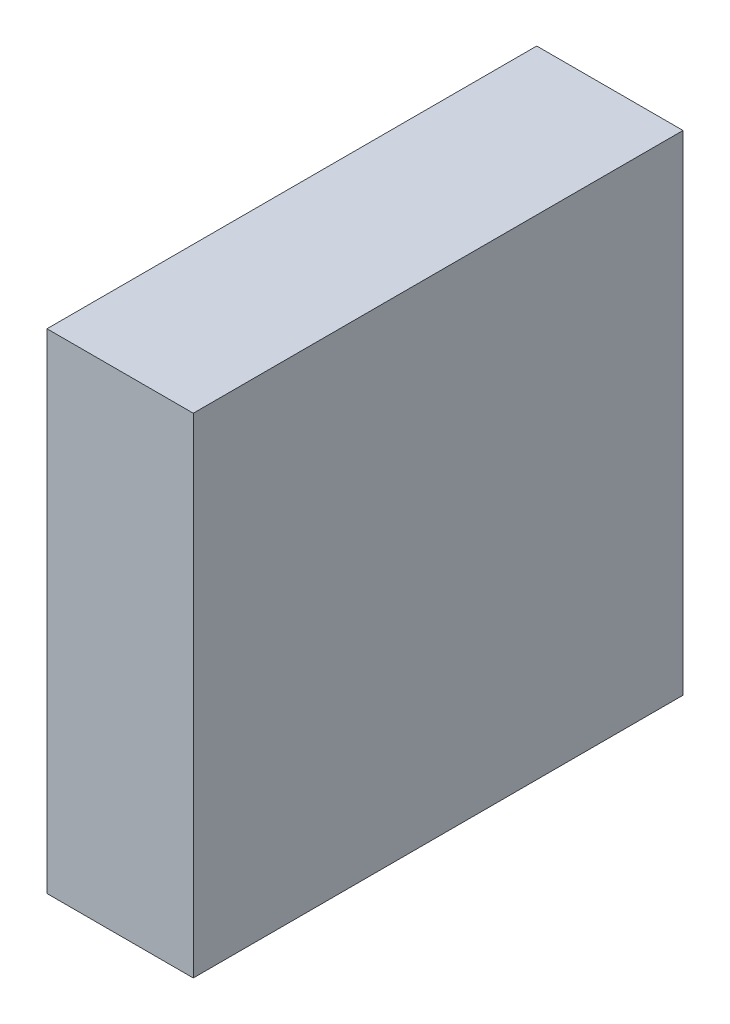
ISO-10303-21;
HEADER;
FILE_DESCRIPTION(('STEP AP214'),'2;1');
FILE_NAME('part.step','',(''),(''),'','','');
FILE_SCHEMA(('AUTOMOTIVE_DESIGN { 1 0 10303 214 1 1 1 1 }'));
ENDSEC;
DATA;
#1=APPLICATION_CONTEXT('core data for automotive mechanical design processes');
#2=APPLICATION_PROTOCOL_DEFINITION('international standard','automotive_design',2000,#1);
#3=PRODUCT_CONTEXT('',#1,'mechanical');
#4=PRODUCT('Part','Part','',(#3));
#5=PRODUCT_RELATED_PRODUCT_CATEGORY('part','',(#4));
#6=PRODUCT_DEFINITION_FORMATION('','',#4);
#7=PRODUCT_DEFINITION_CONTEXT('part definition',#1,'design');
#8=PRODUCT_DEFINITION('design','',#6,#7);
#9=PRODUCT_DEFINITION_SHAPE('','',#8);
#10=(LENGTH_UNIT() NAMED_UNIT(*) SI_UNIT(.MILLI.,.METRE.));
#11=(NAMED_UNIT(*) PLANE_ANGLE_UNIT() SI_UNIT($,.RADIAN.));
#12=(NAMED_UNIT(*) SI_UNIT($,.STERADIAN.) SOLID_ANGLE_UNIT());
#13=UNCERTAINTY_MEASURE_WITH_UNIT(LENGTH_MEASURE(1.E-05),#10,'distance_accuracy_value','');
#14=(GEOMETRIC_REPRESENTATION_CONTEXT(3) GLOBAL_UNCERTAINTY_ASSIGNED_CONTEXT((#13)) GLOBAL_UNIT_ASSIGNED_CONTEXT((#10,
#11,#12)) REPRESENTATION_CONTEXT('',''));
#15=CARTESIAN_POINT('',(0.,0.,0.));
#16=DIRECTION('',(0.,0.,1.));
#17=DIRECTION('',(1.,0.,0.));
#18=AXIS2_PLACEMENT_3D('',#15,#16,#17);
#19=CARTESIAN_POINT('',(0.11949176,0.3994912,0.));
#20=DIRECTION('',(1.,0.,0.));
#21=DIRECTION('',(0.,0.,-1.));
#22=AXIS2_PLACEMENT_3D('',#19,#20,#21);
#23=PLANE('',#22);
#24=DIRECTION('',(0.,0.,-1.));
#25=VECTOR('',#24,1.);
#26=CARTESIAN_POINT('',(0.11949176,-0.3994912,0.));
#27=LINE('',#26,#25);
#28=CARTESIAN_POINT('',(0.11949176,-0.3994912,0.));
#29=VERTEX_POINT('',#28);
#30=CARTESIAN_POINT('',(0.11949176,-0.3994912,0.8));
#31=VERTEX_POINT('',#30);
#32=EDGE_CURVE('E20',#29,#31,#27,.F.);
#33=ORIENTED_EDGE('',*,*,#32,.F.);
#34=DIRECTION('',(0.,1.,0.));
#35=VECTOR('',#34,1.);
#36=CARTESIAN_POINT('',(0.11949176,-0.3994912,0.));
#37=LINE('',#36,#35);
#38=CARTESIAN_POINT('',(0.11949176,0.3994912,0.));
#39=VERTEX_POINT('',#38);
#40=EDGE_CURVE('E80',#29,#39,#37,.T.);
#41=ORIENTED_EDGE('',*,*,#40,.T.);
#42=DIRECTION('',(0.,0.,1.));
#43=VECTOR('',#42,1.);
#44=CARTESIAN_POINT('',(0.11949176,0.3994912,0.));
#45=LINE('',#44,#43);
#46=CARTESIAN_POINT('',(0.11949176,0.3994912,0.8));
#47=VERTEX_POINT('',#46);
#48=EDGE_CURVE('E68',#47,#39,#45,.F.);
#49=ORIENTED_EDGE('',*,*,#48,.F.);
#50=DIRECTION('',(0.,1.,0.));
#51=VECTOR('',#50,1.);
#52=CARTESIAN_POINT('',(0.11949176,-0.3994912,0.8));
#53=LINE('',#52,#51);
#54=EDGE_CURVE('E56',#31,#47,#53,.T.);
#55=ORIENTED_EDGE('',*,*,#54,.F.);
#56=EDGE_LOOP('',(#33,#41,#49,#55));
#57=FACE_BOUND('',#56,.T.);
#58=ADVANCED_FACE('F17',(#57),#23,.T.);
#59=CARTESIAN_POINT('',(0.11949176,-0.3994912,0.));
#60=DIRECTION('',(0.,-1.,0.));
#61=DIRECTION('',(0.,0.,-1.));
#62=AXIS2_PLACEMENT_3D('',#59,#60,#61);
#63=PLANE('',#62);
#64=DIRECTION('',(0.,0.,1.));
#65=VECTOR('',#64,1.);
#66=CARTESIAN_POINT('',(-0.11949176,-0.3994912,0.));
#67=LINE('',#66,#65);
#68=CARTESIAN_POINT('',(-0.11949176,-0.3994912,0.));
#69=VERTEX_POINT('',#68);
#70=CARTESIAN_POINT('',(-0.11949176,-0.3994912,0.8));
#71=VERTEX_POINT('',#70);
#72=EDGE_CURVE('E83',#69,#71,#67,.T.);
#73=ORIENTED_EDGE('',*,*,#72,.F.);
#74=DIRECTION('',(1.,0.,0.));
#75=VECTOR('',#74,1.);
#76=CARTESIAN_POINT('',(-0.11949176,-0.3994912,0.));
#77=LINE('',#76,#75);
#78=EDGE_CURVE('E65',#69,#29,#77,.T.);
#79=ORIENTED_EDGE('',*,*,#78,.T.);
#80=ORIENTED_EDGE('',*,*,#32,.T.);
#81=DIRECTION('',(1.,0.,0.));
#82=VECTOR('',#81,1.);
#83=CARTESIAN_POINT('',(-0.11949176,-0.3994912,0.8));
#84=LINE('',#83,#82);
#85=EDGE_CURVE('E62',#71,#31,#84,.T.);
#86=ORIENTED_EDGE('',*,*,#85,.F.);
#87=EDGE_LOOP('',(#73,#79,#80,#86));
#88=FACE_BOUND('',#87,.T.);
#89=ADVANCED_FACE('F61',(#88),#63,.T.);
#90=CARTESIAN_POINT('',(-0.11949176,-0.3994912,0.8));
#91=DIRECTION('',(0.,0.,1.));
#92=DIRECTION('',(1.,0.,0.));
#93=AXIS2_PLACEMENT_3D('',#90,#91,#92);
#94=PLANE('',#93);
#95=ORIENTED_EDGE('',*,*,#54,.T.);
#96=DIRECTION('',(1.,0.,0.));
#97=VECTOR('',#96,1.);
#98=CARTESIAN_POINT('',(-0.11949176,0.3994912,0.8));
#99=LINE('',#98,#97);
#100=CARTESIAN_POINT('',(-0.11949176,0.3994912,0.8));
#101=VERTEX_POINT('',#100);
#102=EDGE_CURVE('E70',#101,#47,#99,.T.);
#103=ORIENTED_EDGE('',*,*,#102,.F.);
#104=DIRECTION('',(0.,1.,0.));
#105=VECTOR('',#104,1.);
#106=CARTESIAN_POINT('',(-0.11949176,-0.3994912,0.8));
#107=LINE('',#106,#105);
#108=EDGE_CURVE('E74',#71,#101,#107,.T.);
#109=ORIENTED_EDGE('',*,*,#108,.F.);
#110=ORIENTED_EDGE('',*,*,#85,.T.);
#111=EDGE_LOOP('',(#95,#103,#109,#110));
#112=FACE_BOUND('',#111,.T.);
#113=ADVANCED_FACE('F72',(#112),#94,.T.);
#114=CARTESIAN_POINT('',(-0.11949176,0.3994912,0.));
#115=DIRECTION('',(0.,1.,0.));
#116=DIRECTION('',(0.,0.,1.));
#117=AXIS2_PLACEMENT_3D('',#114,#115,#116);
#118=PLANE('',#117);
#119=ORIENTED_EDGE('',*,*,#48,.T.);
#120=DIRECTION('',(1.,0.,0.));
#121=VECTOR('',#120,1.);
#122=CARTESIAN_POINT('',(-0.11949176,0.3994912,0.));
#123=LINE('',#122,#121);
#124=CARTESIAN_POINT('',(-0.11949176,0.3994912,0.));
#125=VERTEX_POINT('',#124);
#126=EDGE_CURVE('E35',#39,#125,#123,.F.);
#127=ORIENTED_EDGE('',*,*,#126,.T.);
#128=DIRECTION('',(0.,0.,1.));
#129=VECTOR('',#128,1.);
#130=CARTESIAN_POINT('',(-0.11949176,0.3994912,0.));
#131=LINE('',#130,#129);
#132=EDGE_CURVE('E26',#101,#125,#131,.F.);
#133=ORIENTED_EDGE('',*,*,#132,.F.);
#134=ORIENTED_EDGE('',*,*,#102,.T.);
#135=EDGE_LOOP('',(#119,#127,#133,#134));
#136=FACE_BOUND('',#135,.T.);
#137=ADVANCED_FACE('F89',(#136),#118,.T.);
#138=CARTESIAN_POINT('',(-0.11949176,-0.3994912,0.));
#139=DIRECTION('',(0.,0.,1.));
#140=DIRECTION('',(1.,0.,0.));
#141=AXIS2_PLACEMENT_3D('',#138,#139,#140);
#142=PLANE('',#141);
#143=ORIENTED_EDGE('',*,*,#126,.F.);
#144=ORIENTED_EDGE('',*,*,#40,.F.);
#145=ORIENTED_EDGE('',*,*,#78,.F.);
#146=DIRECTION('',(0.,1.,0.));
#147=VECTOR('',#146,1.);
#148=CARTESIAN_POINT('',(-0.11949176,-0.3994912,0.));
#149=LINE('',#148,#147);
#150=EDGE_CURVE('E11',#125,#69,#149,.F.);
#151=ORIENTED_EDGE('',*,*,#150,.F.);
#152=EDGE_LOOP('',(#143,#144,#145,#151));
#153=FACE_BOUND('',#152,.T.);
#154=ADVANCED_FACE('F91',(#153),#142,.F.);
#155=CARTESIAN_POINT('',(-0.11949176,-0.3994912,0.));
#156=DIRECTION('',(-1.,0.,0.));
#157=DIRECTION('',(0.,0.,1.));
#158=AXIS2_PLACEMENT_3D('',#155,#156,#157);
#159=PLANE('',#158);
#160=ORIENTED_EDGE('',*,*,#132,.T.);
#161=ORIENTED_EDGE('',*,*,#150,.T.);
#162=ORIENTED_EDGE('',*,*,#72,.T.);
#163=ORIENTED_EDGE('',*,*,#108,.T.);
#164=EDGE_LOOP('',(#160,#161,#162,#163));
#165=FACE_BOUND('',#164,.T.);
#166=ADVANCED_FACE('F88',(#165),#159,.T.);
#167=CLOSED_SHELL('',(#58,#89,#113,#137,#154,#166));
#168=MANIFOLD_SOLID_BREP('B1',#167);
#169=ADVANCED_BREP_SHAPE_REPRESENTATION('',(#18,#168),#14);
#170=SHAPE_DEFINITION_REPRESENTATION(#9,#169);
ENDSEC;
END-ISO-10303-21;
